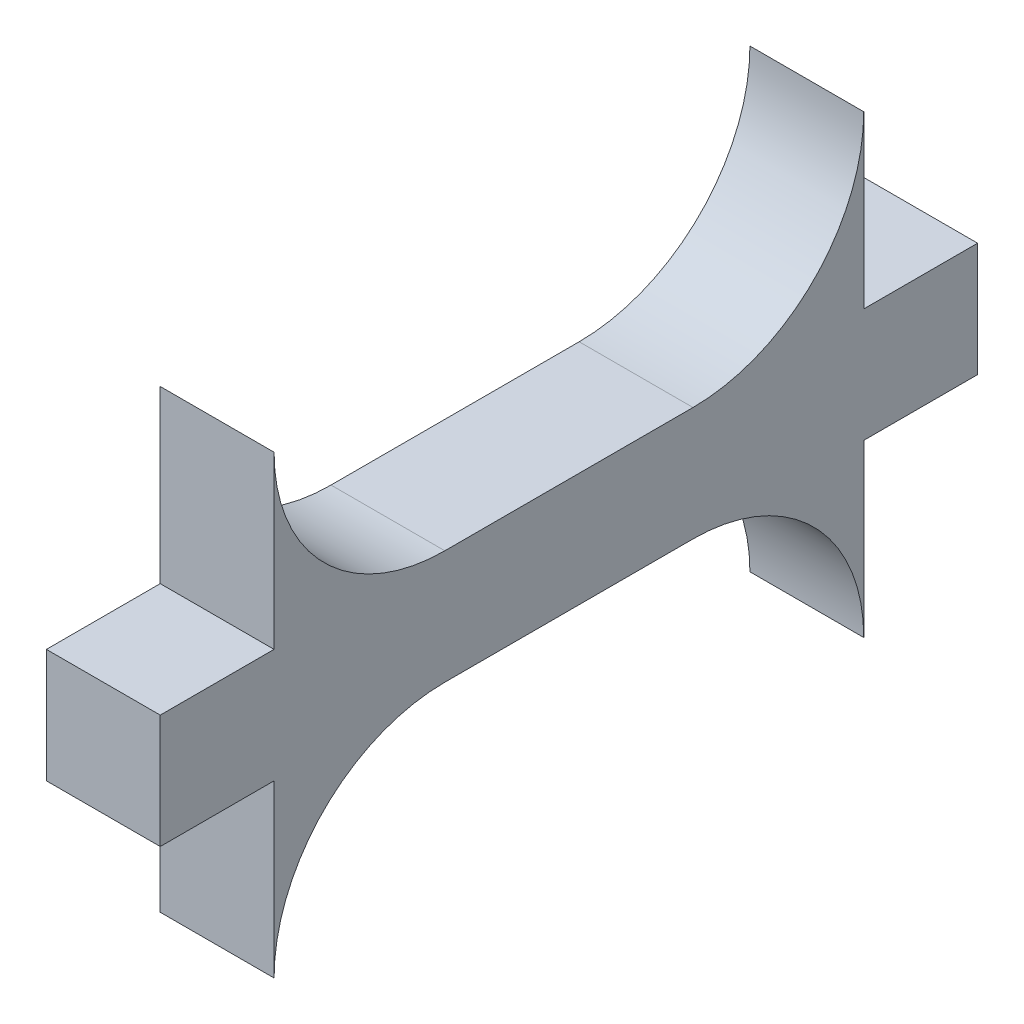
ISO-10303-21;
HEADER;
FILE_DESCRIPTION(('STEP AP214'),'2;1');
FILE_NAME('part.step','',(''),(''),'','','');
FILE_SCHEMA(('AUTOMOTIVE_DESIGN { 1 0 10303 214 1 1 1 1 }'));
ENDSEC;
DATA;
#1=APPLICATION_CONTEXT('core data for automotive mechanical design processes');
#2=APPLICATION_PROTOCOL_DEFINITION('international standard','automotive_design',2000,#1);
#3=PRODUCT_CONTEXT('',#1,'mechanical');
#4=PRODUCT('Part','Part','',(#3));
#5=PRODUCT_RELATED_PRODUCT_CATEGORY('part','',(#4));
#6=PRODUCT_DEFINITION_FORMATION('','',#4);
#7=PRODUCT_DEFINITION_CONTEXT('part definition',#1,'design');
#8=PRODUCT_DEFINITION('design','',#6,#7);
#9=PRODUCT_DEFINITION_SHAPE('','',#8);
#10=(LENGTH_UNIT() NAMED_UNIT(*) SI_UNIT(.MILLI.,.METRE.));
#11=(NAMED_UNIT(*) PLANE_ANGLE_UNIT() SI_UNIT($,.RADIAN.));
#12=(NAMED_UNIT(*) SI_UNIT($,.STERADIAN.) SOLID_ANGLE_UNIT());
#13=UNCERTAINTY_MEASURE_WITH_UNIT(LENGTH_MEASURE(1.E-05),#10,'distance_accuracy_value','');
#14=(GEOMETRIC_REPRESENTATION_CONTEXT(3) GLOBAL_UNCERTAINTY_ASSIGNED_CONTEXT((#13)) GLOBAL_UNIT_ASSIGNED_CONTEXT((#10,
#11,#12)) REPRESENTATION_CONTEXT('',''));
#15=CARTESIAN_POINT('',(0.,0.,0.));
#16=DIRECTION('',(0.,0.,1.));
#17=DIRECTION('',(1.,0.,0.));
#18=AXIS2_PLACEMENT_3D('',#15,#16,#17);
#19=CARTESIAN_POINT('',(10.,20.,-27.9959654178674));
#20=DIRECTION('',(0.,0.,1.));
#21=DIRECTION('',(1.,0.,0.));
#22=AXIS2_PLACEMENT_3D('',#19,#20,#21);
#23=PLANE('',#22);
#24=DIRECTION('',(0.,1.,0.));
#25=VECTOR('',#24,1.);
#26=CARTESIAN_POINT('',(10.,20.,-27.9959654178674));
#27=LINE('',#26,#25);
#28=CARTESIAN_POINT('',(10.,5.,-27.9959654178674));
#29=VERTEX_POINT('',#28);
#30=CARTESIAN_POINT('',(10.,20.,-27.9959654178674));
#31=VERTEX_POINT('',#30);
#32=EDGE_CURVE('E50',#29,#31,#27,.T.);
#33=ORIENTED_EDGE('',*,*,#32,.F.);
#34=DIRECTION('',(-1.,0.,0.));
#35=VECTOR('',#34,1.);
#36=CARTESIAN_POINT('',(0.,5.,-27.9959654178674));
#37=LINE('',#36,#35);
#38=CARTESIAN_POINT('',(0.,5.,-27.9959654178674));
#39=VERTEX_POINT('',#38);
#40=EDGE_CURVE('E181',#29,#39,#37,.T.);
#41=ORIENTED_EDGE('',*,*,#40,.T.);
#42=DIRECTION('',(0.,1.,0.));
#43=VECTOR('',#42,1.);
#44=CARTESIAN_POINT('',(0.,20.,-27.9959654178674));
#45=LINE('',#44,#43);
#46=CARTESIAN_POINT('',(0.,20.,-27.9959654178674));
#47=VERTEX_POINT('',#46);
#48=EDGE_CURVE('E158',#39,#47,#45,.T.);
#49=ORIENTED_EDGE('',*,*,#48,.T.);
#50=DIRECTION('',(-1.,0.,0.));
#51=VECTOR('',#50,1.);
#52=CARTESIAN_POINT('',(10.,20.,-27.9959654178674));
#53=LINE('',#52,#51);
#54=EDGE_CURVE('E264',#31,#47,#53,.T.);
#55=ORIENTED_EDGE('',*,*,#54,.F.);
#56=EDGE_LOOP('',(#33,#41,#49,#55));
#57=FACE_BOUND('',#56,.T.);
#58=ADVANCED_FACE('F35',(#57),#23,.F.);
#59=CARTESIAN_POINT('',(10.,20.,23.8040345821326));
#60=DIRECTION('',(0.,0.,-1.));
#61=DIRECTION('',(-1.,0.,0.));
#62=AXIS2_PLACEMENT_3D('',#59,#60,#61);
#63=PLANE('',#62);
#64=DIRECTION('',(1.,0.,0.));
#65=VECTOR('',#64,1.);
#66=CARTESIAN_POINT('',(10.,-4.99999999999999,23.8040345821326));
#67=LINE('',#66,#65);
#68=CARTESIAN_POINT('',(0.,-5.00000000000001,23.8040345821326));
#69=VERTEX_POINT('',#68);
#70=CARTESIAN_POINT('',(10.,-5.00000000000001,23.8040345821326));
#71=VERTEX_POINT('',#70);
#72=EDGE_CURVE('E162',#69,#71,#67,.T.);
#73=ORIENTED_EDGE('',*,*,#72,.F.);
#74=DIRECTION('',(0.,-1.,0.));
#75=VECTOR('',#74,1.);
#76=CARTESIAN_POINT('',(0.,20.,23.8040345821326));
#77=LINE('',#76,#75);
#78=CARTESIAN_POINT('',(0.,-20.,23.8040345821326));
#79=VERTEX_POINT('',#78);
#80=EDGE_CURVE('E251',#69,#79,#77,.T.);
#81=ORIENTED_EDGE('',*,*,#80,.T.);
#82=DIRECTION('',(-1.,0.,0.));
#83=VECTOR('',#82,1.);
#84=CARTESIAN_POINT('',(10.,-20.,23.8040345821326));
#85=LINE('',#84,#83);
#86=CARTESIAN_POINT('',(10.,-20.,23.8040345821326));
#87=VERTEX_POINT('',#86);
#88=EDGE_CURVE('E236',#87,#79,#85,.T.);
#89=ORIENTED_EDGE('',*,*,#88,.F.);
#90=DIRECTION('',(0.,-1.,0.));
#91=VECTOR('',#90,1.);
#92=CARTESIAN_POINT('',(10.,20.,23.8040345821326));
#93=LINE('',#92,#91);
#94=EDGE_CURVE('E232',#71,#87,#93,.T.);
#95=ORIENTED_EDGE('',*,*,#94,.F.);
#96=EDGE_LOOP('',(#73,#81,#89,#95));
#97=FACE_BOUND('',#96,.T.);
#98=ADVANCED_FACE('F293',(#97),#63,.F.);
#99=DIRECTION('',(-1.,0.,0.));
#100=VECTOR('',#99,1.);
#101=CARTESIAN_POINT('',(0.,5.,23.8040345821326));
#102=LINE('',#101,#100);
#103=CARTESIAN_POINT('',(10.,5.,23.8040345821326));
#104=VERTEX_POINT('',#103);
#105=CARTESIAN_POINT('',(0.,5.,23.8040345821326));
#106=VERTEX_POINT('',#105);
#107=EDGE_CURVE('E193',#104,#106,#102,.T.);
#108=ORIENTED_EDGE('',*,*,#107,.F.);
#109=CARTESIAN_POINT('',(10.,20.,23.8040345821326));
#110=VERTEX_POINT('',#109);
#111=EDGE_CURVE('E233',#110,#104,#93,.T.);
#112=ORIENTED_EDGE('',*,*,#111,.F.);
#113=DIRECTION('',(-1.,0.,0.));
#114=VECTOR('',#113,1.);
#115=CARTESIAN_POINT('',(10.,20.,23.8040345821326));
#116=LINE('',#115,#114);
#117=CARTESIAN_POINT('',(0.,20.,23.8040345821326));
#118=VERTEX_POINT('',#117);
#119=EDGE_CURVE('E255',#110,#118,#116,.T.);
#120=ORIENTED_EDGE('',*,*,#119,.T.);
#121=EDGE_CURVE('E220',#118,#106,#77,.T.);
#122=ORIENTED_EDGE('',*,*,#121,.T.);
#123=EDGE_LOOP('',(#108,#112,#120,#122));
#124=FACE_BOUND('',#123,.T.);
#125=ADVANCED_FACE('F298',(#124),#63,.F.);
#126=CARTESIAN_POINT('',(10.,-20.,8.80403458213257));
#127=DIRECTION('',(-1.,0.,0.));
#128=DIRECTION('',(0.,0.,1.));
#129=AXIS2_PLACEMENT_3D('',#126,#127,#128);
#130=CYLINDRICAL_SURFACE('',#129,15.);
#131=CARTESIAN_POINT('',(0.,-20.,8.80403458213257));
#132=DIRECTION('',(-1.,0.,0.));
#133=DIRECTION('',(0.,0.,-1.));
#134=AXIS2_PLACEMENT_3D('',#131,#132,#133);
#135=CIRCLE('',#134,15.);
#136=CARTESIAN_POINT('',(0.,-5.,8.80403458213257));
#137=VERTEX_POINT('',#136);
#138=EDGE_CURVE('E215',#79,#137,#135,.T.);
#139=ORIENTED_EDGE('',*,*,#138,.T.);
#140=DIRECTION('',(-1.,0.,0.));
#141=VECTOR('',#140,1.);
#142=CARTESIAN_POINT('',(10.,-5.,8.80403458213257));
#143=LINE('',#142,#141);
#144=CARTESIAN_POINT('',(10.,-5.,8.80403458213257));
#145=VERTEX_POINT('',#144);
#146=EDGE_CURVE('E11',#145,#137,#143,.T.);
#147=ORIENTED_EDGE('',*,*,#146,.F.);
#148=CARTESIAN_POINT('',(10.,-20.,8.80403458213257));
#149=DIRECTION('',(-1.,0.,0.));
#150=DIRECTION('',(0.,0.,-1.));
#151=AXIS2_PLACEMENT_3D('',#148,#149,#150);
#152=CIRCLE('',#151,15.);
#153=EDGE_CURVE('E216',#87,#145,#152,.T.);
#154=ORIENTED_EDGE('',*,*,#153,.F.);
#155=ORIENTED_EDGE('',*,*,#88,.T.);
#156=EDGE_LOOP('',(#139,#147,#154,#155));
#157=FACE_BOUND('',#156,.T.);
#158=ADVANCED_FACE('F37',(#157),#130,.F.);
#159=CARTESIAN_POINT('',(10.,-5.,8.80403458213257));
#160=DIRECTION('',(0.,1.,0.));
#161=DIRECTION('',(0.,0.,1.));
#162=AXIS2_PLACEMENT_3D('',#159,#160,#161);
#163=PLANE('',#162);
#164=DIRECTION('',(0.,0.,-1.));
#165=VECTOR('',#164,1.);
#166=CARTESIAN_POINT('',(0.,-5.,8.80403458213257));
#167=LINE('',#166,#165);
#168=CARTESIAN_POINT('',(0.,-5.,-12.9959654178674));
#169=VERTEX_POINT('',#168);
#170=EDGE_CURVE('E239',#137,#169,#167,.T.);
#171=ORIENTED_EDGE('',*,*,#170,.T.);
#172=DIRECTION('',(-1.,0.,0.));
#173=VECTOR('',#172,1.);
#174=CARTESIAN_POINT('',(10.,-5.,-12.9959654178674));
#175=LINE('',#174,#173);
#176=CARTESIAN_POINT('',(10.,-5.,-12.9959654178674));
#177=VERTEX_POINT('',#176);
#178=EDGE_CURVE('E43',#177,#169,#175,.T.);
#179=ORIENTED_EDGE('',*,*,#178,.F.);
#180=DIRECTION('',(0.,0.,-1.));
#181=VECTOR('',#180,1.);
#182=CARTESIAN_POINT('',(10.,-5.,8.80403458213257));
#183=LINE('',#182,#181);
#184=EDGE_CURVE('E219',#145,#177,#183,.T.);
#185=ORIENTED_EDGE('',*,*,#184,.F.);
#186=ORIENTED_EDGE('',*,*,#146,.T.);
#187=EDGE_LOOP('',(#171,#179,#185,#186));
#188=FACE_BOUND('',#187,.T.);
#189=ADVANCED_FACE('F311',(#188),#163,.F.);
#190=CARTESIAN_POINT('',(10.,-20.,-12.9959654178674));
#191=DIRECTION('',(-1.,0.,0.));
#192=DIRECTION('',(0.,0.,1.));
#193=AXIS2_PLACEMENT_3D('',#190,#191,#192);
#194=CYLINDRICAL_SURFACE('',#193,15.);
#195=CARTESIAN_POINT('',(0.,-20.,-12.9959654178674));
#196=DIRECTION('',(-1.,0.,0.));
#197=DIRECTION('',(0.,0.,1.));
#198=AXIS2_PLACEMENT_3D('',#195,#196,#197);
#199=CIRCLE('',#198,15.);
#200=CARTESIAN_POINT('',(0.,-20.,-27.9959654178674));
#201=VERTEX_POINT('',#200);
#202=EDGE_CURVE('E241',#169,#201,#199,.T.);
#203=ORIENTED_EDGE('',*,*,#202,.T.);
#204=DIRECTION('',(-1.,0.,0.));
#205=VECTOR('',#204,1.);
#206=CARTESIAN_POINT('',(10.,-20.,-27.9959654178674));
#207=LINE('',#206,#205);
#208=CARTESIAN_POINT('',(10.,-20.,-27.9959654178674));
#209=VERTEX_POINT('',#208);
#210=EDGE_CURVE('E267',#209,#201,#207,.T.);
#211=ORIENTED_EDGE('',*,*,#210,.F.);
#212=CARTESIAN_POINT('',(10.,-20.,-12.9959654178674));
#213=DIRECTION('',(-1.,0.,0.));
#214=DIRECTION('',(0.,0.,1.));
#215=AXIS2_PLACEMENT_3D('',#212,#213,#214);
#216=CIRCLE('',#215,15.);
#217=EDGE_CURVE('E222',#177,#209,#216,.T.);
#218=ORIENTED_EDGE('',*,*,#217,.F.);
#219=ORIENTED_EDGE('',*,*,#178,.T.);
#220=EDGE_LOOP('',(#203,#211,#218,#219));
#221=FACE_BOUND('',#220,.T.);
#222=ADVANCED_FACE('F274',(#221),#194,.F.);
#223=CARTESIAN_POINT('',(0.,-5.00000000000001,-27.9959654178674));
#224=VERTEX_POINT('',#223);
#225=EDGE_CURVE('E243',#201,#224,#45,.T.);
#226=ORIENTED_EDGE('',*,*,#225,.T.);
#227=DIRECTION('',(1.,0.,0.));
#228=VECTOR('',#227,1.);
#229=CARTESIAN_POINT('',(10.,-4.99999999999999,-27.9959654178674));
#230=LINE('',#229,#228);
#231=CARTESIAN_POINT('',(10.,-5.00000000000001,-27.9959654178674));
#232=VERTEX_POINT('',#231);
#233=EDGE_CURVE('E58',#224,#232,#230,.T.);
#234=ORIENTED_EDGE('',*,*,#233,.T.);
#235=EDGE_CURVE('E224',#209,#232,#27,.T.);
#236=ORIENTED_EDGE('',*,*,#235,.F.);
#237=ORIENTED_EDGE('',*,*,#210,.T.);
#238=EDGE_LOOP('',(#226,#234,#236,#237));
#239=FACE_BOUND('',#238,.T.);
#240=ADVANCED_FACE('F278',(#239),#23,.F.);
#241=CARTESIAN_POINT('',(10.,20.,-12.9959654178674));
#242=DIRECTION('',(-1.,0.,0.));
#243=DIRECTION('',(0.,0.,1.));
#244=AXIS2_PLACEMENT_3D('',#241,#242,#243);
#245=CYLINDRICAL_SURFACE('',#244,15.);
#246=CARTESIAN_POINT('',(0.,20.,-12.9959654178674));
#247=DIRECTION('',(-1.,0.,0.));
#248=DIRECTION('',(0.,0.,-1.));
#249=AXIS2_PLACEMENT_3D('',#246,#247,#248);
#250=CIRCLE('',#249,15.);
#251=CARTESIAN_POINT('',(0.,5.,-12.9959654178674));
#252=VERTEX_POINT('',#251);
#253=EDGE_CURVE('E245',#47,#252,#250,.T.);
#254=ORIENTED_EDGE('',*,*,#253,.T.);
#255=DIRECTION('',(-1.,0.,0.));
#256=VECTOR('',#255,1.);
#257=CARTESIAN_POINT('',(10.,5.,-12.9959654178674));
#258=LINE('',#257,#256);
#259=CARTESIAN_POINT('',(10.,5.,-12.9959654178674));
#260=VERTEX_POINT('',#259);
#261=EDGE_CURVE('E261',#260,#252,#258,.T.);
#262=ORIENTED_EDGE('',*,*,#261,.F.);
#263=CARTESIAN_POINT('',(10.,20.,-12.9959654178674));
#264=DIRECTION('',(-1.,0.,0.));
#265=DIRECTION('',(0.,0.,-1.));
#266=AXIS2_PLACEMENT_3D('',#263,#264,#265);
#267=CIRCLE('',#266,15.);
#268=EDGE_CURVE('E226',#31,#260,#267,.T.);
#269=ORIENTED_EDGE('',*,*,#268,.F.);
#270=ORIENTED_EDGE('',*,*,#54,.T.);
#271=EDGE_LOOP('',(#254,#262,#269,#270));
#272=FACE_BOUND('',#271,.T.);
#273=ADVANCED_FACE('F304',(#272),#245,.F.);
#274=CARTESIAN_POINT('',(10.,5.,8.80403458213257));
#275=DIRECTION('',(0.,-1.,0.));
#276=DIRECTION('',(0.,0.,-1.));
#277=AXIS2_PLACEMENT_3D('',#274,#275,#276);
#278=PLANE('',#277);
#279=DIRECTION('',(0.,0.,1.));
#280=VECTOR('',#279,1.);
#281=CARTESIAN_POINT('',(0.,5.,8.80403458213257));
#282=LINE('',#281,#280);
#283=CARTESIAN_POINT('',(0.,5.,8.80403458213257));
#284=VERTEX_POINT('',#283);
#285=EDGE_CURVE('E247',#252,#284,#282,.T.);
#286=ORIENTED_EDGE('',*,*,#285,.T.);
#287=DIRECTION('',(-1.,0.,0.));
#288=VECTOR('',#287,1.);
#289=CARTESIAN_POINT('',(10.,5.,8.80403458213257));
#290=LINE('',#289,#288);
#291=CARTESIAN_POINT('',(10.,5.,8.80403458213257));
#292=VERTEX_POINT('',#291);
#293=EDGE_CURVE('E258',#292,#284,#290,.T.);
#294=ORIENTED_EDGE('',*,*,#293,.F.);
#295=DIRECTION('',(0.,0.,1.));
#296=VECTOR('',#295,1.);
#297=CARTESIAN_POINT('',(10.,5.,8.80403458213257));
#298=LINE('',#297,#296);
#299=EDGE_CURVE('E228',#260,#292,#298,.T.);
#300=ORIENTED_EDGE('',*,*,#299,.F.);
#301=ORIENTED_EDGE('',*,*,#261,.T.);
#302=EDGE_LOOP('',(#286,#294,#300,#301));
#303=FACE_BOUND('',#302,.T.);
#304=ADVANCED_FACE('F309',(#303),#278,.F.);
#305=CARTESIAN_POINT('',(10.,20.,8.80403458213257));
#306=DIRECTION('',(-1.,0.,0.));
#307=DIRECTION('',(0.,0.,1.));
#308=AXIS2_PLACEMENT_3D('',#305,#306,#307);
#309=CYLINDRICAL_SURFACE('',#308,15.);
#310=CARTESIAN_POINT('',(0.,20.,8.80403458213257));
#311=DIRECTION('',(-1.,0.,0.));
#312=DIRECTION('',(0.,0.,1.));
#313=AXIS2_PLACEMENT_3D('',#310,#311,#312);
#314=CIRCLE('',#313,15.);
#315=EDGE_CURVE('E249',#284,#118,#314,.T.);
#316=ORIENTED_EDGE('',*,*,#315,.T.);
#317=ORIENTED_EDGE('',*,*,#119,.F.);
#318=CARTESIAN_POINT('',(10.,20.,8.80403458213257));
#319=DIRECTION('',(-1.,0.,0.));
#320=DIRECTION('',(0.,0.,1.));
#321=AXIS2_PLACEMENT_3D('',#318,#319,#320);
#322=CIRCLE('',#321,15.);
#323=EDGE_CURVE('E230',#292,#110,#322,.T.);
#324=ORIENTED_EDGE('',*,*,#323,.F.);
#325=ORIENTED_EDGE('',*,*,#293,.T.);
#326=EDGE_LOOP('',(#316,#317,#324,#325));
#327=FACE_BOUND('',#326,.T.);
#328=ADVANCED_FACE('F344',(#327),#309,.F.);
#329=CARTESIAN_POINT('',(10.,-20.,8.80403458213257));
#330=DIRECTION('',(1.,0.,0.));
#331=DIRECTION('',(0.,0.,-1.));
#332=AXIS2_PLACEMENT_3D('',#329,#330,#331);
#333=PLANE('',#332);
#334=ORIENTED_EDGE('',*,*,#153,.T.);
#335=ORIENTED_EDGE('',*,*,#184,.T.);
#336=ORIENTED_EDGE('',*,*,#217,.T.);
#337=ORIENTED_EDGE('',*,*,#235,.T.);
#338=DIRECTION('',(0.,0.,1.));
#339=VECTOR('',#338,1.);
#340=CARTESIAN_POINT('',(10.,-4.99999999999999,-37.9959654178674));
#341=LINE('',#340,#339);
#342=CARTESIAN_POINT('',(10.,-4.99999999999999,-37.9959654178674));
#343=VERTEX_POINT('',#342);
#344=EDGE_CURVE('E185',#343,#232,#341,.T.);
#345=ORIENTED_EDGE('',*,*,#344,.F.);
#346=DIRECTION('',(0.,1.,0.));
#347=VECTOR('',#346,1.);
#348=CARTESIAN_POINT('',(10.,5.00000000000001,-37.9959654178674));
#349=LINE('',#348,#347);
#350=CARTESIAN_POINT('',(10.,5.00000000000001,-37.9959654178674));
#351=VERTEX_POINT('',#350);
#352=EDGE_CURVE('E175',#343,#351,#349,.T.);
#353=ORIENTED_EDGE('',*,*,#352,.T.);
#354=DIRECTION('',(0.,0.,1.));
#355=VECTOR('',#354,1.);
#356=CARTESIAN_POINT('',(10.,5.00000000000001,-37.9959654178674));
#357=LINE('',#356,#355);
#358=EDGE_CURVE('E163',#351,#29,#357,.T.);
#359=ORIENTED_EDGE('',*,*,#358,.T.);
#360=ORIENTED_EDGE('',*,*,#32,.T.);
#361=ORIENTED_EDGE('',*,*,#268,.T.);
#362=ORIENTED_EDGE('',*,*,#299,.T.);
#363=ORIENTED_EDGE('',*,*,#323,.T.);
#364=ORIENTED_EDGE('',*,*,#111,.T.);
#365=DIRECTION('',(0.,0.,-1.));
#366=VECTOR('',#365,1.);
#367=CARTESIAN_POINT('',(10.,5.00000000000001,33.8040345821326));
#368=LINE('',#367,#366);
#369=CARTESIAN_POINT('',(10.,5.00000000000001,33.8040345821326));
#370=VERTEX_POINT('',#369);
#371=EDGE_CURVE('E206',#370,#104,#368,.T.);
#372=ORIENTED_EDGE('',*,*,#371,.F.);
#373=DIRECTION('',(0.,1.,0.));
#374=VECTOR('',#373,1.);
#375=CARTESIAN_POINT('',(10.,5.00000000000001,33.8040345821326));
#376=LINE('',#375,#374);
#377=CARTESIAN_POINT('',(10.,-4.99999999999999,33.8040345821326));
#378=VERTEX_POINT('',#377);
#379=EDGE_CURVE('E195',#378,#370,#376,.T.);
#380=ORIENTED_EDGE('',*,*,#379,.F.);
#381=DIRECTION('',(0.,0.,-1.));
#382=VECTOR('',#381,1.);
#383=CARTESIAN_POINT('',(10.,-4.99999999999999,33.8040345821326));
#384=LINE('',#383,#382);
#385=EDGE_CURVE('E209',#378,#71,#384,.T.);
#386=ORIENTED_EDGE('',*,*,#385,.T.);
#387=ORIENTED_EDGE('',*,*,#94,.T.);
#388=EDGE_LOOP('',(#334,#335,#336,#337,#345,#353,#359,#360,#361,#362,#363,#364,#372,#380,#386,#387));
#389=FACE_BOUND('',#388,.T.);
#390=ADVANCED_FACE('F280',(#389),#333,.T.);
#391=CARTESIAN_POINT('',(0.,-20.,8.80403458213257));
#392=DIRECTION('',(1.,0.,0.));
#393=DIRECTION('',(0.,0.,-1.));
#394=AXIS2_PLACEMENT_3D('',#391,#392,#393);
#395=PLANE('',#394);
#396=ORIENTED_EDGE('',*,*,#138,.F.);
#397=ORIENTED_EDGE('',*,*,#80,.F.);
#398=DIRECTION('',(0.,0.,-1.));
#399=VECTOR('',#398,1.);
#400=CARTESIAN_POINT('',(0.,-5.00000000000001,33.8040345821326));
#401=LINE('',#400,#399);
#402=CARTESIAN_POINT('',(0.,-5.00000000000001,33.8040345821326));
#403=VERTEX_POINT('',#402);
#404=EDGE_CURVE('E212',#403,#69,#401,.T.);
#405=ORIENTED_EDGE('',*,*,#404,.F.);
#406=DIRECTION('',(0.,-1.,0.));
#407=VECTOR('',#406,1.);
#408=CARTESIAN_POINT('',(0.,-5.00000000000001,33.8040345821326));
#409=LINE('',#408,#407);
#410=CARTESIAN_POINT('',(0.,5.,33.8040345821326));
#411=VERTEX_POINT('',#410);
#412=EDGE_CURVE('E189',#411,#403,#409,.T.);
#413=ORIENTED_EDGE('',*,*,#412,.F.);
#414=DIRECTION('',(0.,0.,-1.));
#415=VECTOR('',#414,1.);
#416=CARTESIAN_POINT('',(0.,5.,33.8040345821326));
#417=LINE('',#416,#415);
#418=EDGE_CURVE('E199',#411,#106,#417,.T.);
#419=ORIENTED_EDGE('',*,*,#418,.T.);
#420=ORIENTED_EDGE('',*,*,#121,.F.);
#421=ORIENTED_EDGE('',*,*,#315,.F.);
#422=ORIENTED_EDGE('',*,*,#285,.F.);
#423=ORIENTED_EDGE('',*,*,#253,.F.);
#424=ORIENTED_EDGE('',*,*,#48,.F.);
#425=DIRECTION('',(0.,0.,1.));
#426=VECTOR('',#425,1.);
#427=CARTESIAN_POINT('',(0.,5.,-37.9959654178674));
#428=LINE('',#427,#426);
#429=CARTESIAN_POINT('',(0.,5.,-37.9959654178674));
#430=VERTEX_POINT('',#429);
#431=EDGE_CURVE('E150',#430,#39,#428,.T.);
#432=ORIENTED_EDGE('',*,*,#431,.F.);
#433=DIRECTION('',(0.,-1.,0.));
#434=VECTOR('',#433,1.);
#435=CARTESIAN_POINT('',(0.,-5.00000000000001,-37.9959654178674));
#436=LINE('',#435,#434);
#437=CARTESIAN_POINT('',(0.,-5.00000000000001,-37.9959654178674));
#438=VERTEX_POINT('',#437);
#439=EDGE_CURVE('E155',#430,#438,#436,.T.);
#440=ORIENTED_EDGE('',*,*,#439,.T.);
#441=DIRECTION('',(0.,0.,1.));
#442=VECTOR('',#441,1.);
#443=CARTESIAN_POINT('',(0.,-5.00000000000001,-37.9959654178674));
#444=LINE('',#443,#442);
#445=EDGE_CURVE('E180',#438,#224,#444,.T.);
#446=ORIENTED_EDGE('',*,*,#445,.T.);
#447=ORIENTED_EDGE('',*,*,#225,.F.);
#448=ORIENTED_EDGE('',*,*,#202,.F.);
#449=ORIENTED_EDGE('',*,*,#170,.F.);
#450=EDGE_LOOP('',(#396,#397,#405,#413,#419,#420,#421,#422,#423,#424,#432,#440,#446,#447,#448,#449));
#451=FACE_BOUND('',#450,.T.);
#452=ADVANCED_FACE('F153',(#451),#395,.F.);
#453=CARTESIAN_POINT('',(10.,-4.99999999999999,33.8040345821326));
#454=DIRECTION('',(0.,1.,0.));
#455=DIRECTION('',(-1.,0.,0.));
#456=AXIS2_PLACEMENT_3D('',#453,#454,#455);
#457=PLANE('',#456);
#458=ORIENTED_EDGE('',*,*,#72,.T.);
#459=ORIENTED_EDGE('',*,*,#385,.F.);
#460=DIRECTION('',(1.,0.,0.));
#461=VECTOR('',#460,1.);
#462=CARTESIAN_POINT('',(10.,-4.99999999999999,33.8040345821326));
#463=LINE('',#462,#461);
#464=EDGE_CURVE('E192',#403,#378,#463,.T.);
#465=ORIENTED_EDGE('',*,*,#464,.F.);
#466=ORIENTED_EDGE('',*,*,#404,.T.);
#467=EDGE_LOOP('',(#458,#459,#465,#466));
#468=FACE_BOUND('',#467,.T.);
#469=ADVANCED_FACE('F327',(#468),#457,.F.);
#470=CARTESIAN_POINT('',(0.,5.,33.8040345821326));
#471=DIRECTION('',(0.,-1.,0.));
#472=DIRECTION('',(1.,0.,0.));
#473=AXIS2_PLACEMENT_3D('',#470,#471,#472);
#474=PLANE('',#473);
#475=ORIENTED_EDGE('',*,*,#107,.T.);
#476=ORIENTED_EDGE('',*,*,#418,.F.);
#477=DIRECTION('',(-1.,0.,0.));
#478=VECTOR('',#477,1.);
#479=CARTESIAN_POINT('',(0.,5.,33.8040345821326));
#480=LINE('',#479,#478);
#481=EDGE_CURVE('E197',#370,#411,#480,.T.);
#482=ORIENTED_EDGE('',*,*,#481,.F.);
#483=ORIENTED_EDGE('',*,*,#371,.T.);
#484=EDGE_LOOP('',(#475,#476,#482,#483));
#485=FACE_BOUND('',#484,.T.);
#486=ADVANCED_FACE('F335',(#485),#474,.F.);
#487=CARTESIAN_POINT('',(0.,0.,33.8040345821326));
#488=DIRECTION('',(0.,0.,-1.));
#489=DIRECTION('',(-1.,0.,0.));
#490=AXIS2_PLACEMENT_3D('',#487,#488,#489);
#491=PLANE('',#490);
#492=ORIENTED_EDGE('',*,*,#412,.T.);
#493=ORIENTED_EDGE('',*,*,#464,.T.);
#494=ORIENTED_EDGE('',*,*,#379,.T.);
#495=ORIENTED_EDGE('',*,*,#481,.T.);
#496=EDGE_LOOP('',(#492,#493,#494,#495));
#497=FACE_BOUND('',#496,.T.);
#498=ADVANCED_FACE('F290',(#497),#491,.F.);
#499=CARTESIAN_POINT('',(0.,5.,-37.9959654178674));
#500=DIRECTION('',(0.,1.,0.));
#501=DIRECTION('',(-1.,0.,0.));
#502=AXIS2_PLACEMENT_3D('',#499,#500,#501);
#503=PLANE('',#502);
#504=ORIENTED_EDGE('',*,*,#40,.F.);
#505=ORIENTED_EDGE('',*,*,#358,.F.);
#506=DIRECTION('',(-1.,0.,0.));
#507=VECTOR('',#506,1.);
#508=CARTESIAN_POINT('',(0.,5.,-37.9959654178674));
#509=LINE('',#508,#507);
#510=EDGE_CURVE('E169',#351,#430,#509,.T.);
#511=ORIENTED_EDGE('',*,*,#510,.T.);
#512=ORIENTED_EDGE('',*,*,#431,.T.);
#513=EDGE_LOOP('',(#504,#505,#511,#512));
#514=FACE_BOUND('',#513,.T.);
#515=ADVANCED_FACE('F174',(#514),#503,.T.);
#516=CARTESIAN_POINT('',(10.,-4.99999999999999,-37.9959654178674));
#517=DIRECTION('',(0.,-1.,0.));
#518=DIRECTION('',(1.,0.,0.));
#519=AXIS2_PLACEMENT_3D('',#516,#517,#518);
#520=PLANE('',#519);
#521=ORIENTED_EDGE('',*,*,#233,.F.);
#522=ORIENTED_EDGE('',*,*,#445,.F.);
#523=DIRECTION('',(1.,0.,0.));
#524=VECTOR('',#523,1.);
#525=CARTESIAN_POINT('',(10.,-4.99999999999999,-37.9959654178674));
#526=LINE('',#525,#524);
#527=EDGE_CURVE('E172',#438,#343,#526,.T.);
#528=ORIENTED_EDGE('',*,*,#527,.T.);
#529=ORIENTED_EDGE('',*,*,#344,.T.);
#530=EDGE_LOOP('',(#521,#522,#528,#529));
#531=FACE_BOUND('',#530,.T.);
#532=ADVANCED_FACE('F282',(#531),#520,.T.);
#533=CARTESIAN_POINT('',(0.,0.,-37.9959654178674));
#534=DIRECTION('',(0.,0.,1.));
#535=DIRECTION('',(-1.,0.,0.));
#536=AXIS2_PLACEMENT_3D('',#533,#534,#535);
#537=PLANE('',#536);
#538=ORIENTED_EDGE('',*,*,#439,.F.);
#539=ORIENTED_EDGE('',*,*,#510,.F.);
#540=ORIENTED_EDGE('',*,*,#352,.F.);
#541=ORIENTED_EDGE('',*,*,#527,.F.);
#542=EDGE_LOOP('',(#538,#539,#540,#541));
#543=FACE_BOUND('',#542,.T.);
#544=ADVANCED_FACE('F167',(#543),#537,.F.);
#545=CLOSED_SHELL('',(#58,#98,#125,#158,#189,#222,#240,#273,#304,#328,#390,#452,#469,#486,#498,
#515,#532,#544));
#546=MANIFOLD_SOLID_BREP('B2',#545);
#547=ADVANCED_BREP_SHAPE_REPRESENTATION('',(#18,#546),#14);
#548=SHAPE_DEFINITION_REPRESENTATION(#9,#547);
ENDSEC;
END-ISO-10303-21;
